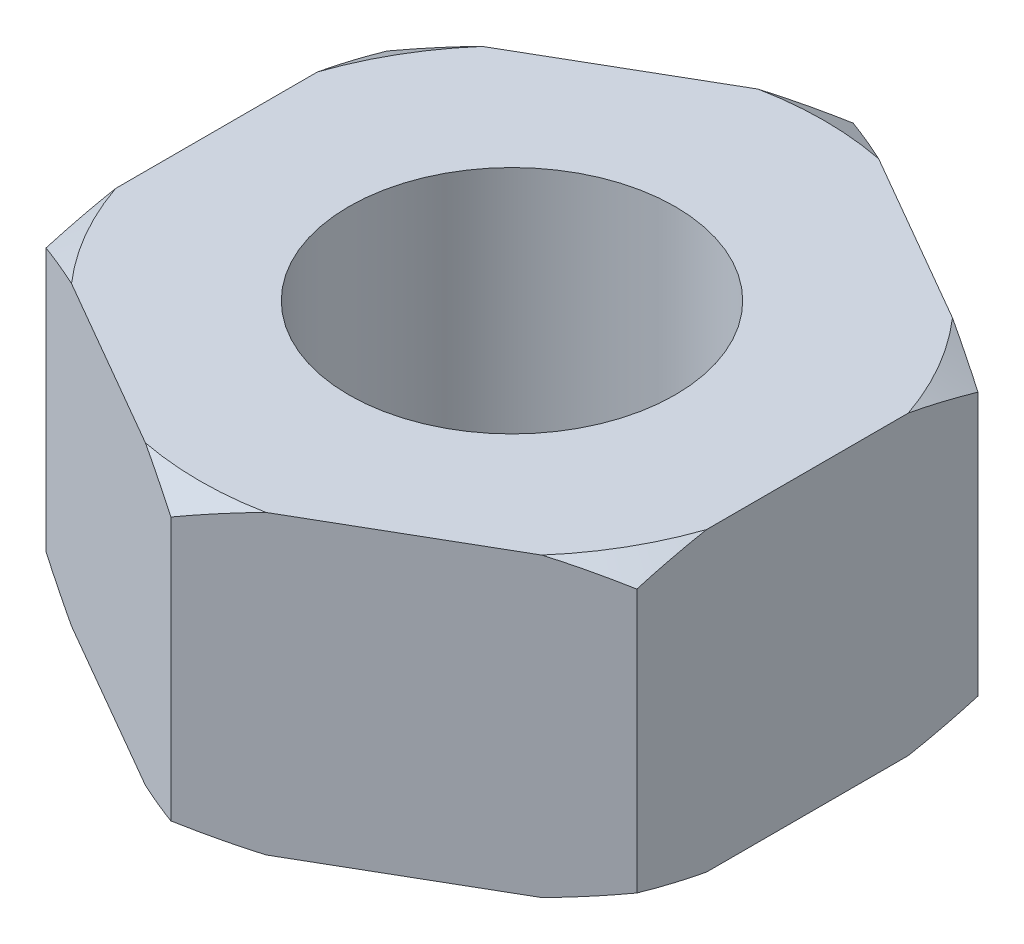
ISO-10303-21;
HEADER;
FILE_DESCRIPTION(('STEP AP214'),'2;1');
FILE_NAME('part.step','',(''),(''),'','','');
FILE_SCHEMA(('AUTOMOTIVE_DESIGN { 1 0 10303 214 1 1 1 1 }'));
ENDSEC;
DATA;
#1=APPLICATION_CONTEXT('core data for automotive mechanical design processes');
#2=APPLICATION_PROTOCOL_DEFINITION('international standard','automotive_design',2000,#1);
#3=PRODUCT_CONTEXT('',#1,'mechanical');
#4=PRODUCT('Part','Part','',(#3));
#5=PRODUCT_RELATED_PRODUCT_CATEGORY('part','',(#4));
#6=PRODUCT_DEFINITION_FORMATION('','',#4);
#7=PRODUCT_DEFINITION_CONTEXT('part definition',#1,'design');
#8=PRODUCT_DEFINITION('design','',#6,#7);
#9=PRODUCT_DEFINITION_SHAPE('','',#8);
#10=(LENGTH_UNIT() NAMED_UNIT(*) SI_UNIT(.MILLI.,.METRE.));
#11=(NAMED_UNIT(*) PLANE_ANGLE_UNIT() SI_UNIT($,.RADIAN.));
#12=(NAMED_UNIT(*) SI_UNIT($,.STERADIAN.) SOLID_ANGLE_UNIT());
#13=UNCERTAINTY_MEASURE_WITH_UNIT(LENGTH_MEASURE(1.E-05),#10,'distance_accuracy_value','');
#14=(GEOMETRIC_REPRESENTATION_CONTEXT(3) GLOBAL_UNCERTAINTY_ASSIGNED_CONTEXT((#13)) GLOBAL_UNIT_ASSIGNED_CONTEXT((#10,
#11,#12)) REPRESENTATION_CONTEXT('',''));
#15=CARTESIAN_POINT('',(0.,0.,0.));
#16=DIRECTION('',(0.,0.,1.));
#17=DIRECTION('',(1.,0.,0.));
#18=AXIS2_PLACEMENT_3D('',#15,#16,#17);
#19=CARTESIAN_POINT('',(0.,3.,0.));
#20=DIRECTION('',(0.,-1.,0.));
#21=DIRECTION('',(0.,0.,-1.));
#22=AXIS2_PLACEMENT_3D('',#19,#20,#21);
#23=CONICAL_SURFACE('',#22,3.15717967697245,1.0471975511966);
#24=CARTESIAN_POINT('',(-2.98778764305632,2.83073800433458,-1.72569999999995));
#25=CARTESIAN_POINT('',(-2.98778764305632,2.87453234537664,-1.57408157926667));
#26=CARTESIAN_POINT('',(-2.98778764305632,2.91436354131147,-1.42115441667415));
#27=CARTESIAN_POINT('',(-2.98778764305631,2.98389351559366,-1.11265129721507));
#28=CARTESIAN_POINT('',(-2.98778764305631,3.01356768949335,-0.957069853495317));
#29=CARTESIAN_POINT('',(-2.98778764305631,3.05976564084917,-0.647835363848516));
#30=CARTESIAN_POINT('',(-2.98778764305631,3.07659679214302,-0.494229932389961));
#31=CARTESIAN_POINT('',(-2.9877876430563,3.0966996775807,-0.186295293789725));
#32=CARTESIAN_POINT('',(-2.9877876430563,3.09998804807221,-0.0319672079559725));
#33=CARTESIAN_POINT('',(-2.9877876430563,3.09319336195354,0.256470525833416));
#34=CARTESIAN_POINT('',(-2.9877876430563,3.0847786451927,0.390623074181776));
#35=CARTESIAN_POINT('',(-2.98778764305629,3.05809454989863,0.658054054039131));
#36=CARTESIAN_POINT('',(-2.98778764305629,3.03981603195721,0.791331558663171));
#37=CARTESIAN_POINT('',(-2.98778764305629,2.99411549339855,1.0593151542391));
#38=CARTESIAN_POINT('',(-2.98778764305628,2.96649950437058,1.19398728015132));
#39=CARTESIAN_POINT('',(-2.98778764305628,2.90381989839535,1.46132146027543));
#40=CARTESIAN_POINT('',(-2.98778764305628,2.86877103517279,1.59398694672896));
#41=CARTESIAN_POINT('',(-2.98778764305628,2.83073800433458,1.72570000000003));
#42=B_SPLINE_CURVE_WITH_KNOTS('',3,(#24,#25,#26,#27,#28,#29,#30,#31,#32,#33,#34,#35,#36,#37,#38,
#39,#40,#41),.UNSPECIFIED.,.F.,.F.,(4,2,2,2,2,2,2,2,4),(0.,0.473636195491021,0.94841174288621,
1.41143339225394,1.87388608232874,2.27675078121051,2.67998940112553,3.09217948458054,
3.50355893241453),.UNSPECIFIED.);
#43=CARTESIAN_POINT('',(-2.98778764305629,3.,1.02024924047411));
#44=VERTEX_POINT('',#43);
#45=CARTESIAN_POINT('',(-2.98778764305628,2.83094010767586,1.72500000000003));
#46=VERTEX_POINT('',#45);
#47=EDGE_CURVE('E425',#44,#46,#42,.T.);
#48=ORIENTED_EDGE('',*,*,#47,.T.);
#49=CARTESIAN_POINT('',(-2.98848764305628,2.83070673334709,1.7245958548116));
#50=CARTESIAN_POINT('',(-2.85718065584434,2.87450364187515,1.80040597922489));
#51=CARTESIAN_POINT('',(-2.72474025480589,2.91433756491633,1.87687048041602));
#52=CARTESIAN_POINT('',(-2.45756537307024,2.98387319936846,2.03112397030679));
#53=CARTESIAN_POINT('',(-2.3228261396034,3.01355030277322,2.10891570301927));
#54=CARTESIAN_POINT('',(-2.05501778344575,3.05975404564121,2.26353492953812));
#55=CARTESIAN_POINT('',(-1.92198990306803,3.07658807660561,2.34033861208392));
#56=CARTESIAN_POINT('',(-1.6553071402995,3.09669652809824,2.49430797695656));
#57=CARTESIAN_POINT('',(-1.52165322938043,3.0999875873303,2.57147309840393));
#58=CARTESIAN_POINT('',(-1.2718429741216,3.09319715341216,2.71570111652394));
#59=CARTESIAN_POINT('',(-1.15564952564982,3.08478295899708,2.78278543527719));
#60=CARTESIAN_POINT('',(-0.924019747822204,3.05809745691394,2.91651694985829));
#61=CARTESIAN_POINT('',(-0.80858422161751,3.0398170042283,2.98316368198662));
#62=CARTESIAN_POINT('',(-0.57647558161307,2.99411042437658,3.11717166777442));
#63=CARTESIAN_POINT('',(-0.459831894697397,2.96649025096054,3.18451593181445));
#64=CARTESIAN_POINT('',(-0.228285776446345,2.90380068605167,3.3181991455165));
#65=CARTESIAN_POINT('',(-0.113380370999478,2.86874605619617,3.38453981228259));
#66=CARTESIAN_POINT('',(0.000700000000045206,2.83070673334709,3.45040414518842));
#67=B_SPLINE_CURVE_WITH_KNOTS('',3,(#49,#50,#51,#52,#53,#54,#55,#56,#57,#58,#59,#60,#61,#62,#63,
#64,#65,#66),.UNSPECIFIED.,.F.,.F.,(4,2,2,2,2,2,2,2,4),(0.,0.473643612206693,0.948426779423881,
1.41145513696918,1.87391445426214,2.27682707364599,2.6801137950185,3.09235452755995,
3.50378426473884),.UNSPECIFIED.);
#68=CARTESIAN_POINT('',(-2.37745558197045,3.,2.07737537976298));
#69=VERTEX_POINT('',#68);
#70=EDGE_CURVE('E52',#46,#69,#67,.T.);
#71=ORIENTED_EDGE('',*,*,#70,.T.);
#72=CARTESIAN_POINT('',(0.,3.,0.));
#73=DIRECTION('',(0.,1.,0.));
#74=DIRECTION('',(0.,0.,1.));
#75=AXIS2_PLACEMENT_3D('',#72,#73,#74);
#76=CIRCLE('',#75,3.15717967697245);
#77=EDGE_CURVE('E206',#44,#69,#76,.T.);
#78=ORIENTED_EDGE('',*,*,#77,.F.);
#79=EDGE_LOOP('',(#48,#71,#78));
#80=FACE_BOUND('',#79,.T.);
#81=ADVANCED_FACE('F46',(#80),#23,.T.);
#82=CARTESIAN_POINT('',(0.000699999999953867,2.83070673334709,-3.45040414518842));
#83=CARTESIAN_POINT('',(-0.130606987211985,2.87450364187515,-3.37459402077512));
#84=CARTESIAN_POINT('',(-0.263047388250431,2.91433756491633,-3.29812951958399));
#85=CARTESIAN_POINT('',(-0.530222269986073,2.98387319936846,-3.14387602969321));
#86=CARTESIAN_POINT('',(-0.664961503452909,3.01355030277322,-3.06608429698072));
#87=CARTESIAN_POINT('',(-0.932769859610556,3.05975404564121,-2.91146507046187));
#88=CARTESIAN_POINT('',(-1.06579773998828,3.07658807660561,-2.83466138791607));
#89=CARTESIAN_POINT('',(-1.3324805027568,3.09669652809824,-2.68069202304342));
#90=CARTESIAN_POINT('',(-1.46613441367587,3.0999875873303,-2.60352690159605));
#91=CARTESIAN_POINT('',(-1.7159446689347,3.09319715341216,-2.45929888347603));
#92=CARTESIAN_POINT('',(-1.83213811740647,3.08478295899708,-2.39221456472278));
#93=CARTESIAN_POINT('',(-2.06376789523409,3.05809745691394,-2.25848305014167));
#94=CARTESIAN_POINT('',(-2.17920342143878,3.0398170042283,-2.19183631801334));
#95=CARTESIAN_POINT('',(-2.41131206144322,2.99411042437658,-2.05782833222554));
#96=CARTESIAN_POINT('',(-2.52795574835889,2.96649025096054,-1.9904840681855));
#97=CARTESIAN_POINT('',(-2.75950186660994,2.90380068605167,-1.85680085448344));
#98=CARTESIAN_POINT('',(-2.8744072720568,2.86874605619617,-1.79046018771735));
#99=CARTESIAN_POINT('',(-2.98848764305632,2.83070673334709,-1.72459585481152));
#100=B_SPLINE_CURVE_WITH_KNOTS('',3,(#82,#83,#84,#85,#86,#87,#88,#89,#90,#91,#92,#93,#94,#95,
#96,#97,#98,#99),.UNSPECIFIED.,.F.,.F.,(4,2,2,2,2,2,2,2,4),(0.,0.473643612206694,
0.948426779423881,1.41145513696918,1.87391445426214,2.27682707364599,2.6801137950185,
3.09235452755995,3.50378426473884),.UNSPECIFIED.);
#101=CARTESIAN_POINT('',(-2.3774555819705,3.,-2.07737537976292));
#102=VERTEX_POINT('',#101);
#103=CARTESIAN_POINT('',(-2.98778764305632,2.83094010767586,-1.72499999999995));
#104=VERTEX_POINT('',#103);
#105=EDGE_CURVE('E280',#102,#104,#100,.T.);
#106=ORIENTED_EDGE('',*,*,#105,.T.);
#107=CARTESIAN_POINT('',(-2.98778764305631,3.,-1.02024924047403));
#108=VERTEX_POINT('',#107);
#109=EDGE_CURVE('E281',#104,#108,#42,.T.);
#110=ORIENTED_EDGE('',*,*,#109,.T.);
#111=EDGE_CURVE('E211',#102,#108,#76,.T.);
#112=ORIENTED_EDGE('',*,*,#111,.F.);
#113=EDGE_LOOP('',(#106,#110,#112));
#114=FACE_BOUND('',#113,.T.);
#115=ADVANCED_FACE('F393',(#114),#23,.T.);
#116=CARTESIAN_POINT('',(2.98848764305628,2.83070673334709,-1.7245958548116));
#117=CARTESIAN_POINT('',(2.85718065584434,2.87450364187515,-1.80040597922489));
#118=CARTESIAN_POINT('',(2.72474025480589,2.91433756491633,-1.87687048041602));
#119=CARTESIAN_POINT('',(2.45756537307024,2.98387319936846,-2.03112397030679));
#120=CARTESIAN_POINT('',(2.3228261396034,3.01355030277322,-2.10891570301927));
#121=CARTESIAN_POINT('',(2.05501778344575,3.05975404564121,-2.26353492953812));
#122=CARTESIAN_POINT('',(1.92198990306803,3.07658807660561,-2.34033861208392));
#123=CARTESIAN_POINT('',(1.6553071402995,3.09669652809824,-2.49430797695656));
#124=CARTESIAN_POINT('',(1.52165322938043,3.09998758733029,-2.57147309840393));
#125=CARTESIAN_POINT('',(1.2718429741216,3.09319715341216,-2.71570111652394));
#126=CARTESIAN_POINT('',(1.15564952564982,3.08478295899708,-2.78278543527719));
#127=CARTESIAN_POINT('',(0.924019747822203,3.05809745691394,-2.9165169498583));
#128=CARTESIAN_POINT('',(0.808584221617508,3.0398170042283,-2.98316368198662));
#129=CARTESIAN_POINT('',(0.576475581613069,2.99411042437658,-3.11717166777442));
#130=CARTESIAN_POINT('',(0.459831894697396,2.96649025096054,-3.18451593181445));
#131=CARTESIAN_POINT('',(0.228285776446344,2.90380068605167,-3.3181991455165));
#132=CARTESIAN_POINT('',(0.113380370999477,2.86874605619617,-3.38453981228259));
#133=CARTESIAN_POINT('',(-0.000700000000046562,2.83070673334709,-3.45040414518842));
#134=B_SPLINE_CURVE_WITH_KNOTS('',3,(#116,#117,#118,#119,#120,#121,#122,#123,#124,#125,#126,
#127,#128,#129,#130,#131,#132,#133),.UNSPECIFIED.,.F.,.F.,(4,2,2,2,2,2,2,2,4),(0.,
0.473643612206694,0.948426779423881,1.41145513696918,1.87391445426214,2.27682707364599,
2.6801137950185,3.09235452755995,3.50378426473884),.UNSPECIFIED.);
#135=CARTESIAN_POINT('',(0.610332061085784,3.,-3.09762462023703));
#136=VERTEX_POINT('',#135);
#137=CARTESIAN_POINT('',(0.,2.83094010767586,-3.44999999999998));
#138=VERTEX_POINT('',#137);
#139=EDGE_CURVE('E268',#136,#138,#134,.T.);
#140=ORIENTED_EDGE('',*,*,#139,.T.);
#141=CARTESIAN_POINT('',(-0.610332061085866,3.,-3.09762462023702));
#142=VERTEX_POINT('',#141);
#143=EDGE_CURVE('E273',#138,#142,#100,.T.);
#144=ORIENTED_EDGE('',*,*,#143,.T.);
#145=EDGE_CURVE('E204',#136,#142,#76,.T.);
#146=ORIENTED_EDGE('',*,*,#145,.F.);
#147=EDGE_LOOP('',(#140,#144,#146));
#148=FACE_BOUND('',#147,.T.);
#149=ADVANCED_FACE('F398',(#148),#23,.T.);
#150=CARTESIAN_POINT('',(2.98778764305632,2.83073800433458,1.72569999999995));
#151=CARTESIAN_POINT('',(2.98778764305632,2.87453234537664,1.57408157926667));
#152=CARTESIAN_POINT('',(2.98778764305632,2.91436354131147,1.42115441667415));
#153=CARTESIAN_POINT('',(2.98778764305631,2.98389351559366,1.11265129721507));
#154=CARTESIAN_POINT('',(2.98778764305631,3.01356768949335,0.957069853495318));
#155=CARTESIAN_POINT('',(2.98778764305631,3.05976564084917,0.647835363848517));
#156=CARTESIAN_POINT('',(2.98778764305631,3.07659679214302,0.494229932389961));
#157=CARTESIAN_POINT('',(2.9877876430563,3.0966996775807,0.186295293789725));
#158=CARTESIAN_POINT('',(2.9877876430563,3.09998804807221,0.0319672079559729));
#159=CARTESIAN_POINT('',(2.9877876430563,3.09319336195354,-0.256470525833416));
#160=CARTESIAN_POINT('',(2.98778764305629,3.0847786451927,-0.390623074181777));
#161=CARTESIAN_POINT('',(2.98778764305629,3.05809454989863,-0.658054054039132));
#162=CARTESIAN_POINT('',(2.98778764305629,3.03981603195721,-0.791331558663172));
#163=CARTESIAN_POINT('',(2.98778764305629,2.99411549339855,-1.0593151542391));
#164=CARTESIAN_POINT('',(2.98778764305628,2.96649950437058,-1.19398728015132));
#165=CARTESIAN_POINT('',(2.98778764305628,2.90381989839535,-1.46132146027543));
#166=CARTESIAN_POINT('',(2.98778764305628,2.86877103517279,-1.59398694672896));
#167=CARTESIAN_POINT('',(2.98778764305628,2.83073800433458,-1.72570000000003));
#168=B_SPLINE_CURVE_WITH_KNOTS('',3,(#150,#151,#152,#153,#154,#155,#156,#157,#158,#159,#160,
#161,#162,#163,#164,#165,#166,#167),.UNSPECIFIED.,.F.,.F.,(4,2,2,2,2,2,2,2,4),(0.,
0.473636195491021,0.94841174288621,1.41143339225394,1.87388608232874,2.27675078121051,
2.67998940112553,3.09217948458054,3.50355893241453),.UNSPECIFIED.);
#169=CARTESIAN_POINT('',(2.98778764305629,3.,-1.02024924047412));
#170=VERTEX_POINT('',#169);
#171=CARTESIAN_POINT('',(2.98778764305628,2.83094010767586,-1.72500000000003));
#172=VERTEX_POINT('',#171);
#173=EDGE_CURVE('E183',#170,#172,#168,.T.);
#174=ORIENTED_EDGE('',*,*,#173,.T.);
#175=CARTESIAN_POINT('',(2.37745558197045,3.,-2.07737537976298));
#176=VERTEX_POINT('',#175);
#177=EDGE_CURVE('E196',#172,#176,#134,.T.);
#178=ORIENTED_EDGE('',*,*,#177,.T.);
#179=EDGE_CURVE('E201',#170,#176,#76,.T.);
#180=ORIENTED_EDGE('',*,*,#179,.F.);
#181=EDGE_LOOP('',(#174,#178,#180));
#182=FACE_BOUND('',#181,.T.);
#183=ADVANCED_FACE('F403',(#182),#23,.T.);
#184=CARTESIAN_POINT('',(2.3774555819705,3.,2.07737537976292));
#185=VERTEX_POINT('',#184);
#186=CARTESIAN_POINT('',(2.98778764305631,3.,1.02024924047404));
#187=VERTEX_POINT('',#186);
#188=EDGE_CURVE('E195',#185,#187,#76,.T.);
#189=ORIENTED_EDGE('',*,*,#188,.F.);
#190=CARTESIAN_POINT('',(-0.000699999999955139,2.83070673334709,3.45040414518842));
#191=CARTESIAN_POINT('',(0.130606987211983,2.87450364187515,3.37459402077512));
#192=CARTESIAN_POINT('',(0.26304738825043,2.91433756491634,3.29812951958399));
#193=CARTESIAN_POINT('',(0.530222269986072,2.98387319936846,3.14387602969321));
#194=CARTESIAN_POINT('',(0.664961503452908,3.01355030277322,3.06608429698072));
#195=CARTESIAN_POINT('',(0.932769859610555,3.05975404564121,2.91146507046187));
#196=CARTESIAN_POINT('',(1.06579773998827,3.07658807660561,2.83466138791607));
#197=CARTESIAN_POINT('',(1.3324805027568,3.09669652809824,2.68069202304342));
#198=CARTESIAN_POINT('',(1.46613441367587,3.0999875873303,2.60352690159605));
#199=CARTESIAN_POINT('',(1.7159446689347,3.09319715341216,2.45929888347603));
#200=CARTESIAN_POINT('',(1.83213811740647,3.08478295899708,2.39221456472278));
#201=CARTESIAN_POINT('',(2.06376789523409,3.05809745691394,2.25848305014167));
#202=CARTESIAN_POINT('',(2.17920342143878,3.0398170042283,2.19183631801334));
#203=CARTESIAN_POINT('',(2.41131206144322,2.99411042437658,2.05782833222554));
#204=CARTESIAN_POINT('',(2.52795574835889,2.96649025096054,1.9904840681855));
#205=CARTESIAN_POINT('',(2.75950186660994,2.90380068605167,1.85680085448344));
#206=CARTESIAN_POINT('',(2.8744072720568,2.86874605619617,1.79046018771735));
#207=CARTESIAN_POINT('',(2.98848764305632,2.83070673334709,1.72459585481152));
#208=B_SPLINE_CURVE_WITH_KNOTS('',3,(#190,#191,#192,#193,#194,#195,#196,#197,#198,#199,#200,
#201,#202,#203,#204,#205,#206,#207),.UNSPECIFIED.,.F.,.F.,(4,2,2,2,2,2,2,2,4),(0.,
0.473643612206694,0.94842677942388,1.41145513696918,1.87391445426214,2.27682707364599,
2.6801137950185,3.09235452755995,3.50378426473884),.UNSPECIFIED.);
#209=CARTESIAN_POINT('',(2.98778764305632,2.83094010767586,1.72499999999995));
#210=VERTEX_POINT('',#209);
#211=EDGE_CURVE('E64',#185,#210,#208,.T.);
#212=ORIENTED_EDGE('',*,*,#211,.T.);
#213=EDGE_CURVE('E181',#210,#187,#168,.T.);
#214=ORIENTED_EDGE('',*,*,#213,.T.);
#215=EDGE_LOOP('',(#189,#212,#214));
#216=FACE_BOUND('',#215,.T.);
#217=ADVANCED_FACE('F194',(#216),#23,.T.);
#218=CARTESIAN_POINT('',(-0.610332061085783,3.,3.09762462023703));
#219=VERTEX_POINT('',#218);
#220=CARTESIAN_POINT('',(0.,2.83094010767586,3.44999999999998));
#221=VERTEX_POINT('',#220);
#222=EDGE_CURVE('E62',#219,#221,#67,.T.);
#223=ORIENTED_EDGE('',*,*,#222,.T.);
#224=CARTESIAN_POINT('',(0.610332061085864,3.,3.09762462023702));
#225=VERTEX_POINT('',#224);
#226=EDGE_CURVE('E12',#221,#225,#208,.T.);
#227=ORIENTED_EDGE('',*,*,#226,.T.);
#228=EDGE_CURVE('E203',#219,#225,#76,.T.);
#229=ORIENTED_EDGE('',*,*,#228,.F.);
#230=EDGE_LOOP('',(#223,#227,#229));
#231=FACE_BOUND('',#230,.T.);
#232=ADVANCED_FACE('F49',(#231),#23,.T.);
#233=CARTESIAN_POINT('',(0.,3.,0.));
#234=DIRECTION('',(0.,1.,0.));
#235=DIRECTION('',(0.,0.,1.));
#236=AXIS2_PLACEMENT_3D('',#233,#234,#235);
#237=PLANE('',#236);
#238=CARTESIAN_POINT('',(0.,3.,0.));
#239=DIRECTION('',(0.,-1.,0.));
#240=DIRECTION('',(0.,0.,-1.));
#241=AXIS2_PLACEMENT_3D('',#238,#239,#240);
#242=CIRCLE('',#241,1.65);
#243=CARTESIAN_POINT('',(0.,3.,-1.65));
#244=VERTEX_POINT('',#243);
#245=EDGE_CURVE('E340',#244,#244,#242,.T.);
#246=ORIENTED_EDGE('',*,*,#245,.T.);
#247=EDGE_LOOP('',(#246));
#248=FACE_BOUND('',#247,.T.);
#249=ORIENTED_EDGE('',*,*,#228,.T.);
#250=DIRECTION('',(0.866025403784432,0.,-0.500000000000011));
#251=VECTOR('',#250,1.);
#252=CARTESIAN_POINT('',(0.,3.,3.44999999999998));
#253=LINE('',#252,#251);
#254=EDGE_CURVE('E189',#225,#185,#253,.T.);
#255=ORIENTED_EDGE('',*,*,#254,.T.);
#256=ORIENTED_EDGE('',*,*,#188,.T.);
#257=DIRECTION('',(0.,0.,-1.));
#258=VECTOR('',#257,1.);
#259=CARTESIAN_POINT('',(2.98778764305632,3.,1.72499999999995));
#260=LINE('',#259,#258);
#261=EDGE_CURVE('E178',#187,#170,#260,.T.);
#262=ORIENTED_EDGE('',*,*,#261,.T.);
#263=ORIENTED_EDGE('',*,*,#179,.T.);
#264=DIRECTION('',(-0.866025403784445,0.,-0.499999999999989));
#265=VECTOR('',#264,1.);
#266=CARTESIAN_POINT('',(2.98778764305628,3.,-1.72500000000003));
#267=LINE('',#266,#265);
#268=EDGE_CURVE('E188',#176,#136,#267,.T.);
#269=ORIENTED_EDGE('',*,*,#268,.T.);
#270=ORIENTED_EDGE('',*,*,#145,.T.);
#271=DIRECTION('',(-0.866025403784432,0.,0.500000000000011));
#272=VECTOR('',#271,1.);
#273=CARTESIAN_POINT('',(0.,3.,-3.44999999999998));
#274=LINE('',#273,#272);
#275=EDGE_CURVE('E344',#142,#102,#274,.T.);
#276=ORIENTED_EDGE('',*,*,#275,.T.);
#277=ORIENTED_EDGE('',*,*,#111,.T.);
#278=DIRECTION('',(0.,0.,1.));
#279=VECTOR('',#278,1.);
#280=CARTESIAN_POINT('',(-2.98778764305632,3.,-1.72499999999995));
#281=LINE('',#280,#279);
#282=EDGE_CURVE('E347',#108,#44,#281,.T.);
#283=ORIENTED_EDGE('',*,*,#282,.T.);
#284=ORIENTED_EDGE('',*,*,#77,.T.);
#285=DIRECTION('',(0.866025403784445,0.,0.499999999999989));
#286=VECTOR('',#285,1.);
#287=CARTESIAN_POINT('',(-2.98778764305628,3.,1.72500000000003));
#288=LINE('',#287,#286);
#289=EDGE_CURVE('E350',#69,#219,#288,.T.);
#290=ORIENTED_EDGE('',*,*,#289,.T.);
#291=EDGE_LOOP('',(#249,#255,#256,#262,#263,#269,#270,#276,#277,#283,#284,#290));
#292=FACE_BOUND('',#291,.T.);
#293=ADVANCED_FACE('F200',(#248,#292),#237,.T.);
#294=CARTESIAN_POINT('',(0.,0.,3.44999999999998));
#295=DIRECTION('',(0.500000000000011,0.,0.866025403784432));
#296=DIRECTION('',(0.866025403784432,0.,-0.500000000000011));
#297=AXIS2_PLACEMENT_3D('',#294,#295,#296);
#298=PLANE('',#297);
#299=DIRECTION('',(0.,1.,0.));
#300=VECTOR('',#299,1.);
#301=CARTESIAN_POINT('',(2.98778764305632,0.,1.72499999999995));
#302=LINE('',#301,#300);
#303=CARTESIAN_POINT('',(2.98778764305632,0.169059892324141,1.72499999999995));
#304=VERTEX_POINT('',#303);
#305=EDGE_CURVE('E71',#304,#210,#302,.T.);
#306=ORIENTED_EDGE('',*,*,#305,.T.);
#307=ORIENTED_EDGE('',*,*,#211,.F.);
#308=ORIENTED_EDGE('',*,*,#254,.F.);
#309=ORIENTED_EDGE('',*,*,#226,.F.);
#310=DIRECTION('',(0.,1.,0.));
#311=VECTOR('',#310,1.);
#312=CARTESIAN_POINT('',(0.,0.,3.44999999999998));
#313=LINE('',#312,#311);
#314=CARTESIAN_POINT('',(0.,0.169059892324141,3.44999999999998));
#315=VERTEX_POINT('',#314);
#316=EDGE_CURVE('E353',#315,#221,#313,.T.);
#317=ORIENTED_EDGE('',*,*,#316,.F.);
#318=CARTESIAN_POINT('',(2.98848764305632,0.169293266652908,1.72459585481152));
#319=CARTESIAN_POINT('',(2.85718065584438,0.125496358124845,1.80040597922481));
#320=CARTESIAN_POINT('',(2.72474025480594,0.0856624350836629,1.87687048041595));
#321=CARTESIAN_POINT('',(2.4575653730703,0.0161268006315367,2.03112397030673));
#322=CARTESIAN_POINT('',(2.32282613960346,-0.013550302773221,2.10891570301921));
#323=CARTESIAN_POINT('',(2.05501778344581,-0.0597540456412099,2.26353492953807));
#324=CARTESIAN_POINT('',(1.92198990306809,-0.0765880766056098,2.34033861208387));
#325=CARTESIAN_POINT('',(1.65530714029957,-0.096696528098241,2.49430797695652));
#326=CARTESIAN_POINT('',(1.5216532293805,-0.0999875873302971,2.57147309840389));
#327=CARTESIAN_POINT('',(1.27184297412167,-0.0931971534121613,2.71570111652391));
#328=CARTESIAN_POINT('',(1.1556495256499,-0.0847829589970818,2.78278543527716));
#329=CARTESIAN_POINT('',(0.92401974782228,-0.0580974569139427,2.91651694985827));
#330=CARTESIAN_POINT('',(0.808584221617588,-0.0398170042283034,2.9831636819866));
#331=CARTESIAN_POINT('',(0.576475581613151,0.00588957562342028,3.1171716677744));
#332=CARTESIAN_POINT('',(0.459831894697481,0.0335097490394607,3.18451593181444));
#333=CARTESIAN_POINT('',(0.228285776446432,0.0961993139483314,3.3181991455165));
#334=CARTESIAN_POINT('',(0.113380370999567,0.131253943803826,3.38453981228259));
#335=CARTESIAN_POINT('',(-0.000699999999955318,0.169293266652908,3.45040414518842));
#336=B_SPLINE_CURVE_WITH_KNOTS('',3,(#318,#319,#320,#321,#322,#323,#324,#325,#326,#327,#328,
#329,#330,#331,#332,#333,#334,#335),.UNSPECIFIED.,.F.,.F.,(4,2,2,2,2,2,2,2,4),(0.,
0.473643612206693,0.94842677942388,1.41145513696918,1.87391445426214,2.27682707364599,
2.6801137950185,3.09235452755995,3.50378426473884),.UNSPECIFIED.);
#337=CARTESIAN_POINT('',(0.610332061085854,0.,3.09762462023702));
#338=VERTEX_POINT('',#337);
#339=EDGE_CURVE('E230',#338,#315,#336,.T.);
#340=ORIENTED_EDGE('',*,*,#339,.F.);
#341=DIRECTION('',(0.866025403784432,0.,-0.500000000000011));
#342=VECTOR('',#341,1.);
#343=CARTESIAN_POINT('',(0.,0.,3.44999999999998));
#344=LINE('',#343,#342);
#345=CARTESIAN_POINT('',(2.37745558197051,0.,2.07737537976292));
#346=VERTEX_POINT('',#345);
#347=EDGE_CURVE('E352',#338,#346,#344,.T.);
#348=ORIENTED_EDGE('',*,*,#347,.T.);
#349=EDGE_CURVE('E224',#304,#346,#336,.T.);
#350=ORIENTED_EDGE('',*,*,#349,.F.);
#351=EDGE_LOOP('',(#306,#307,#308,#309,#317,#340,#348,#350));
#352=FACE_BOUND('',#351,.T.);
#353=ADVANCED_FACE('F252',(#352),#298,.T.);
#354=CARTESIAN_POINT('',(-2.98778764305628,0.,1.72500000000003));
#355=DIRECTION('',(-0.499999999999989,0.,0.866025403784445));
#356=DIRECTION('',(0.866025403784445,0.,0.499999999999989));
#357=AXIS2_PLACEMENT_3D('',#354,#355,#356);
#358=PLANE('',#357);
#359=ORIENTED_EDGE('',*,*,#316,.T.);
#360=ORIENTED_EDGE('',*,*,#222,.F.);
#361=ORIENTED_EDGE('',*,*,#289,.F.);
#362=ORIENTED_EDGE('',*,*,#70,.F.);
#363=DIRECTION('',(0.,1.,0.));
#364=VECTOR('',#363,1.);
#365=CARTESIAN_POINT('',(-2.98778764305628,0.,1.72500000000003));
#366=LINE('',#365,#364);
#367=CARTESIAN_POINT('',(-2.98778764305628,0.169059892324141,1.72500000000003));
#368=VERTEX_POINT('',#367);
#369=EDGE_CURVE('E357',#368,#46,#366,.T.);
#370=ORIENTED_EDGE('',*,*,#369,.F.);
#371=CARTESIAN_POINT('',(0.000700000000044852,0.169293266652908,3.45040414518842));
#372=CARTESIAN_POINT('',(-0.130606987211896,0.125496358124845,3.37459402077513));
#373=CARTESIAN_POINT('',(-0.263047388250343,0.0856624350836628,3.298129519584));
#374=CARTESIAN_POINT('',(-0.53022226998599,0.0161268006315365,3.14387602969322));
#375=CARTESIAN_POINT('',(-0.664961503452828,-0.0135503027732213,3.06608429698074));
#376=CARTESIAN_POINT('',(-0.932769859610479,-0.0597540456412101,2.91146507046189));
#377=CARTESIAN_POINT('',(-1.0657977399882,-0.0765880766056098,2.83466138791609));
#378=CARTESIAN_POINT('',(-1.33248050275673,-0.0966965280982409,2.68069202304345));
#379=CARTESIAN_POINT('',(-1.4661344136758,-0.0999875873302971,2.60352690159609));
#380=CARTESIAN_POINT('',(-1.71594466893463,-0.0931971534121613,2.45929888347607));
#381=CARTESIAN_POINT('',(-1.83213811740641,-0.0847829589970816,2.39221456472283));
#382=CARTESIAN_POINT('',(-2.06376789523403,-0.0580974569139424,2.25848305014172));
#383=CARTESIAN_POINT('',(-2.17920342143872,-0.0398170042283031,2.1918363180134));
#384=CARTESIAN_POINT('',(-2.41131206144316,0.00588957562342046,2.0578283322256));
#385=CARTESIAN_POINT('',(-2.52795574835884,0.0335097490394607,1.99048406818557));
#386=CARTESIAN_POINT('',(-2.75950186660989,0.0961993139483314,1.85680085448351));
#387=CARTESIAN_POINT('',(-2.87440727205675,0.131253943803826,1.79046018771742));
#388=CARTESIAN_POINT('',(-2.98848764305628,0.169293266652908,1.7245958548116));
#389=B_SPLINE_CURVE_WITH_KNOTS('',3,(#371,#372,#373,#374,#375,#376,#377,#378,#379,#380,#381,
#382,#383,#384,#385,#386,#387,#388),.UNSPECIFIED.,.F.,.F.,(4,2,2,2,2,2,2,2,4),(0.,
0.473643612206694,0.948426779423881,1.41145513696918,1.87391445426214,2.27682707364599,
2.6801137950185,3.09235452755995,3.50378426473884),.UNSPECIFIED.);
#390=CARTESIAN_POINT('',(-2.37745558197046,0.,2.07737537976298));
#391=VERTEX_POINT('',#390);
#392=EDGE_CURVE('E242',#391,#368,#389,.T.);
#393=ORIENTED_EDGE('',*,*,#392,.F.);
#394=DIRECTION('',(0.866025403784445,0.,0.499999999999989));
#395=VECTOR('',#394,1.);
#396=CARTESIAN_POINT('',(-2.98778764305628,0.,1.72500000000003));
#397=LINE('',#396,#395);
#398=CARTESIAN_POINT('',(-0.610332061085774,0.,3.09762462023704));
#399=VERTEX_POINT('',#398);
#400=EDGE_CURVE('E333',#391,#399,#397,.T.);
#401=ORIENTED_EDGE('',*,*,#400,.T.);
#402=EDGE_CURVE('E235',#315,#399,#389,.T.);
#403=ORIENTED_EDGE('',*,*,#402,.F.);
#404=EDGE_LOOP('',(#359,#360,#361,#362,#370,#393,#401,#403));
#405=FACE_BOUND('',#404,.T.);
#406=ADVANCED_FACE('F257',(#405),#358,.T.);
#407=CARTESIAN_POINT('',(-2.98778764305632,0.,-1.72499999999995));
#408=DIRECTION('',(-1.,0.,0.));
#409=DIRECTION('',(0.,0.,1.));
#410=AXIS2_PLACEMENT_3D('',#407,#408,#409);
#411=PLANE('',#410);
#412=ORIENTED_EDGE('',*,*,#369,.T.);
#413=ORIENTED_EDGE('',*,*,#47,.F.);
#414=ORIENTED_EDGE('',*,*,#282,.F.);
#415=ORIENTED_EDGE('',*,*,#109,.F.);
#416=DIRECTION('',(0.,1.,0.));
#417=VECTOR('',#416,1.);
#418=CARTESIAN_POINT('',(-2.98778764305632,0.,-1.72499999999995));
#419=LINE('',#418,#417);
#420=CARTESIAN_POINT('',(-2.98778764305632,0.169059892324141,-1.72499999999995));
#421=VERTEX_POINT('',#420);
#422=EDGE_CURVE('E360',#421,#104,#419,.T.);
#423=ORIENTED_EDGE('',*,*,#422,.F.);
#424=CARTESIAN_POINT('',(-2.98778764305628,0.169261995665415,1.72570000000003));
#425=CARTESIAN_POINT('',(-2.98778764305628,0.125467654623359,1.57408157926675));
#426=CARTESIAN_POINT('',(-2.98778764305628,0.0856364586885326,1.42115441667423));
#427=CARTESIAN_POINT('',(-2.98778764305629,0.0161064844063391,1.11265129721515));
#428=CARTESIAN_POINT('',(-2.98778764305629,-0.0135676894933535,0.957069853495395));
#429=CARTESIAN_POINT('',(-2.98778764305629,-0.0597656408491712,0.647835363848594));
#430=CARTESIAN_POINT('',(-2.98778764305629,-0.0765967921430249,0.494229932390039));
#431=CARTESIAN_POINT('',(-2.9877876430563,-0.0966996775807003,0.186295293789803));
#432=CARTESIAN_POINT('',(-2.9877876430563,-0.0999880480722097,0.0319672079560505));
#433=CARTESIAN_POINT('',(-2.9877876430563,-0.0931933619535433,-0.256470525833338));
#434=CARTESIAN_POINT('',(-2.98778764305631,-0.0847786451927023,-0.390623074181699));
#435=CARTESIAN_POINT('',(-2.98778764305631,-0.0580945498986308,-0.658054054039053));
#436=CARTESIAN_POINT('',(-2.98778764305631,-0.0398160319572125,-0.791331558663093));
#437=CARTESIAN_POINT('',(-2.98778764305631,0.00588450660144837,-1.05931515423902));
#438=CARTESIAN_POINT('',(-2.98778764305632,0.0335004956294212,-1.19398728015125));
#439=CARTESIAN_POINT('',(-2.98778764305632,0.0961801016046479,-1.46132146027535));
#440=CARTESIAN_POINT('',(-2.98778764305632,0.131228964827213,-1.59398694672888));
#441=CARTESIAN_POINT('',(-2.98778764305632,0.169261995665415,-1.72569999999995));
#442=B_SPLINE_CURVE_WITH_KNOTS('',3,(#424,#425,#426,#427,#428,#429,#430,#431,#432,#433,#434,
#435,#436,#437,#438,#439,#440,#441),.UNSPECIFIED.,.F.,.F.,(4,2,2,2,2,2,2,2,4),(0.,
0.473636195491021,0.94841174288621,1.41143339225394,1.87388608232874,2.27675078121051,
2.67998940112553,3.09217948458054,3.50355893241453),.UNSPECIFIED.);
#443=CARTESIAN_POINT('',(-2.98778764305631,0.,-1.02024924047404));
#444=VERTEX_POINT('',#443);
#445=EDGE_CURVE('E312',#444,#421,#442,.T.);
#446=ORIENTED_EDGE('',*,*,#445,.F.);
#447=DIRECTION('',(0.,0.,1.));
#448=VECTOR('',#447,1.);
#449=CARTESIAN_POINT('',(-2.98778764305632,0.,-1.72499999999995));
#450=LINE('',#449,#448);
#451=CARTESIAN_POINT('',(-2.98778764305629,0.,1.02024924047412));
#452=VERTEX_POINT('',#451);
#453=EDGE_CURVE('E331',#444,#452,#450,.T.);
#454=ORIENTED_EDGE('',*,*,#453,.T.);
#455=EDGE_CURVE('E318',#368,#452,#442,.T.);
#456=ORIENTED_EDGE('',*,*,#455,.F.);
#457=EDGE_LOOP('',(#412,#413,#414,#415,#423,#446,#454,#456));
#458=FACE_BOUND('',#457,.T.);
#459=ADVANCED_FACE('F291',(#458),#411,.T.);
#460=CARTESIAN_POINT('',(0.,0.,-3.44999999999998));
#461=DIRECTION('',(-0.500000000000011,0.,-0.866025403784432));
#462=DIRECTION('',(-0.866025403784432,0.,0.500000000000011));
#463=AXIS2_PLACEMENT_3D('',#460,#461,#462);
#464=PLANE('',#463);
#465=ORIENTED_EDGE('',*,*,#422,.T.);
#466=ORIENTED_EDGE('',*,*,#105,.F.);
#467=ORIENTED_EDGE('',*,*,#275,.F.);
#468=ORIENTED_EDGE('',*,*,#143,.F.);
#469=DIRECTION('',(0.,1.,0.));
#470=VECTOR('',#469,1.);
#471=CARTESIAN_POINT('',(0.,0.,-3.44999999999998));
#472=LINE('',#471,#470);
#473=CARTESIAN_POINT('',(0.,0.169059892324141,-3.44999999999998));
#474=VERTEX_POINT('',#473);
#475=EDGE_CURVE('E362',#474,#138,#472,.T.);
#476=ORIENTED_EDGE('',*,*,#475,.F.);
#477=CARTESIAN_POINT('',(-2.98848764305632,0.169293266652908,-1.72459585481152));
#478=CARTESIAN_POINT('',(-2.85718065584438,0.125496358124846,-1.80040597922481));
#479=CARTESIAN_POINT('',(-2.72474025480594,0.0856624350836633,-1.87687048041595));
#480=CARTESIAN_POINT('',(-2.4575653730703,0.0161268006315371,-2.03112397030673));
#481=CARTESIAN_POINT('',(-2.32282613960346,-0.0135503027732205,-2.10891570301921));
#482=CARTESIAN_POINT('',(-2.05501778344581,-0.0597540456412096,-2.26353492953807));
#483=CARTESIAN_POINT('',(-1.92198990306809,-0.0765880766056096,-2.34033861208387));
#484=CARTESIAN_POINT('',(-1.65530714029957,-0.0966965280982407,-2.49430797695652));
#485=CARTESIAN_POINT('',(-1.5216532293805,-0.0999875873302966,-2.57147309840389));
#486=CARTESIAN_POINT('',(-1.27184297412167,-0.0931971534121608,-2.71570111652391));
#487=CARTESIAN_POINT('',(-1.1556495256499,-0.0847829589970813,-2.78278543527716));
#488=CARTESIAN_POINT('',(-0.924019747822281,-0.0580974569139422,-2.91651694985827));
#489=CARTESIAN_POINT('',(-0.808584221617588,-0.0398170042283029,-2.9831636819866));
#490=CARTESIAN_POINT('',(-0.576475581613152,0.00588957562342078,-3.1171716677744));
#491=CARTESIAN_POINT('',(-0.459831894697481,0.0335097490394611,-3.18451593181444));
#492=CARTESIAN_POINT('',(-0.228285776446433,0.0961993139483318,-3.3181991455165));
#493=CARTESIAN_POINT('',(-0.113380370999568,0.131253943803826,-3.38453981228259));
#494=CARTESIAN_POINT('',(0.0006999999999539,0.169293266652908,-3.45040414518842));
#495=B_SPLINE_CURVE_WITH_KNOTS('',3,(#477,#478,#479,#480,#481,#482,#483,#484,#485,#486,#487,
#488,#489,#490,#491,#492,#493,#494),.UNSPECIFIED.,.F.,.F.,(4,2,2,2,2,2,2,2,4),(0.,
0.473643612206694,0.948426779423881,1.41145513696918,1.87391445426214,2.27682707364599,
2.6801137950185,3.09235452755995,3.50378426473884),.UNSPECIFIED.);
#496=CARTESIAN_POINT('',(-0.610332061085857,0.,-3.09762462023702));
#497=VERTEX_POINT('',#496);
#498=EDGE_CURVE('E297',#497,#474,#495,.T.);
#499=ORIENTED_EDGE('',*,*,#498,.F.);
#500=DIRECTION('',(-0.866025403784432,0.,0.500000000000011));
#501=VECTOR('',#500,1.);
#502=CARTESIAN_POINT('',(0.,0.,-3.44999999999998));
#503=LINE('',#502,#501);
#504=CARTESIAN_POINT('',(-2.37745558197051,0.,-2.07737537976292));
#505=VERTEX_POINT('',#504);
#506=EDGE_CURVE('E329',#497,#505,#503,.T.);
#507=ORIENTED_EDGE('',*,*,#506,.T.);
#508=EDGE_CURVE('E304',#421,#505,#495,.T.);
#509=ORIENTED_EDGE('',*,*,#508,.F.);
#510=EDGE_LOOP('',(#465,#466,#467,#468,#476,#499,#507,#509));
#511=FACE_BOUND('',#510,.T.);
#512=ADVANCED_FACE('F287',(#511),#464,.T.);
#513=CARTESIAN_POINT('',(2.98778764305628,0.,-1.72500000000003));
#514=DIRECTION('',(0.499999999999989,0.,-0.866025403784445));
#515=DIRECTION('',(-0.866025403784445,0.,-0.499999999999989));
#516=AXIS2_PLACEMENT_3D('',#513,#514,#515);
#517=PLANE('',#516);
#518=ORIENTED_EDGE('',*,*,#475,.T.);
#519=ORIENTED_EDGE('',*,*,#139,.F.);
#520=ORIENTED_EDGE('',*,*,#268,.F.);
#521=ORIENTED_EDGE('',*,*,#177,.F.);
#522=DIRECTION('',(0.,1.,0.));
#523=VECTOR('',#522,1.);
#524=CARTESIAN_POINT('',(2.98778764305628,0.,-1.72500000000003));
#525=LINE('',#524,#523);
#526=CARTESIAN_POINT('',(2.98778764305628,0.16905989232414,-1.72500000000003));
#527=VERTEX_POINT('',#526);
#528=EDGE_CURVE('E78',#527,#172,#525,.T.);
#529=ORIENTED_EDGE('',*,*,#528,.F.);
#530=CARTESIAN_POINT('',(-0.000700000000046133,0.169293266652908,-3.45040414518842));
#531=CARTESIAN_POINT('',(0.130606987211894,0.125496358124846,-3.37459402077513));
#532=CARTESIAN_POINT('',(0.263047388250342,0.0856624350836635,-3.298129519584));
#533=CARTESIAN_POINT('',(0.530222269985989,0.0161268006315371,-3.14387602969322));
#534=CARTESIAN_POINT('',(0.664961503452827,-0.0135503027732207,-3.06608429698074));
#535=CARTESIAN_POINT('',(0.932769859610478,-0.0597540456412097,-2.9114650704619));
#536=CARTESIAN_POINT('',(1.0657977399882,-0.0765880766056095,-2.83466138791609));
#537=CARTESIAN_POINT('',(1.33248050275673,-0.0966965280982408,-2.68069202304346));
#538=CARTESIAN_POINT('',(1.4661344136758,-0.0999875873302971,-2.60352690159609));
#539=CARTESIAN_POINT('',(1.71594466893463,-0.0931971534121614,-2.45929888347608));
#540=CARTESIAN_POINT('',(1.83213811740641,-0.0847829589970818,-2.39221456472283));
#541=CARTESIAN_POINT('',(2.06376789523403,-0.0580974569139425,-2.25848305014172));
#542=CARTESIAN_POINT('',(2.17920342143872,-0.0398170042283032,-2.1918363180134));
#543=CARTESIAN_POINT('',(2.41131206144316,0.00588957562342045,-2.0578283322256));
#544=CARTESIAN_POINT('',(2.52795574835883,0.0335097490394607,-1.99048406818557));
#545=CARTESIAN_POINT('',(2.75950186660989,0.0961993139483311,-1.85680085448351));
#546=CARTESIAN_POINT('',(2.87440727205675,0.131253943803826,-1.79046018771742));
#547=CARTESIAN_POINT('',(2.98848764305628,0.169293266652907,-1.7245958548116));
#548=B_SPLINE_CURVE_WITH_KNOTS('',3,(#530,#531,#532,#533,#534,#535,#536,#537,#538,#539,#540,
#541,#542,#543,#544,#545,#546,#547),.UNSPECIFIED.,.F.,.F.,(4,2,2,2,2,2,2,2,4),(0.,
0.473643612206694,0.94842677942388,1.41145513696918,1.87391445426214,2.27682707364599,
2.6801137950185,3.09235452755995,3.50378426473884),.UNSPECIFIED.);
#549=CARTESIAN_POINT('',(2.37745558197046,0.,-2.07737537976298));
#550=VERTEX_POINT('',#549);
#551=EDGE_CURVE('E306',#550,#527,#548,.T.);
#552=ORIENTED_EDGE('',*,*,#551,.F.);
#553=DIRECTION('',(-0.866025403784445,0.,-0.499999999999989));
#554=VECTOR('',#553,1.);
#555=CARTESIAN_POINT('',(2.98778764305628,0.,-1.72500000000003));
#556=LINE('',#555,#554);
#557=CARTESIAN_POINT('',(0.610332061085774,0.,-3.09762462023704));
#558=VERTEX_POINT('',#557);
#559=EDGE_CURVE('E336',#550,#558,#556,.T.);
#560=ORIENTED_EDGE('',*,*,#559,.T.);
#561=EDGE_CURVE('E305',#474,#558,#548,.T.);
#562=ORIENTED_EDGE('',*,*,#561,.F.);
#563=EDGE_LOOP('',(#518,#519,#520,#521,#529,#552,#560,#562));
#564=FACE_BOUND('',#563,.T.);
#565=ADVANCED_FACE('F290',(#564),#517,.T.);
#566=CARTESIAN_POINT('',(2.98778764305632,0.,1.72499999999995));
#567=DIRECTION('',(1.,0.,0.));
#568=DIRECTION('',(0.,0.,-1.));
#569=AXIS2_PLACEMENT_3D('',#566,#567,#568);
#570=PLANE('',#569);
#571=ORIENTED_EDGE('',*,*,#528,.T.);
#572=ORIENTED_EDGE('',*,*,#173,.F.);
#573=ORIENTED_EDGE('',*,*,#261,.F.);
#574=ORIENTED_EDGE('',*,*,#213,.F.);
#575=ORIENTED_EDGE('',*,*,#305,.F.);
#576=CARTESIAN_POINT('',(2.98778764305628,0.169261995665415,-1.72570000000003));
#577=CARTESIAN_POINT('',(2.98778764305628,0.125467654623358,-1.57408157926675));
#578=CARTESIAN_POINT('',(2.98778764305628,0.0856364586885319,-1.42115441667423));
#579=CARTESIAN_POINT('',(2.98778764305628,0.0161064844063385,-1.11265129721515));
#580=CARTESIAN_POINT('',(2.98778764305629,-0.0135676894933539,-0.957069853495397));
#581=CARTESIAN_POINT('',(2.98778764305629,-0.0597656408491717,-0.647835363848596));
#582=CARTESIAN_POINT('',(2.98778764305629,-0.0765967921430256,-0.49422993239004));
#583=CARTESIAN_POINT('',(2.9877876430563,-0.096699677580701,-0.186295293789804));
#584=CARTESIAN_POINT('',(2.9877876430563,-0.0999880480722103,-0.0319672079560521));
#585=CARTESIAN_POINT('',(2.9877876430563,-0.0931933619535439,0.256470525833337));
#586=CARTESIAN_POINT('',(2.9877876430563,-0.0847786451927031,0.390623074181697));
#587=CARTESIAN_POINT('',(2.98778764305631,-0.0580945498986316,0.658054054039052));
#588=CARTESIAN_POINT('',(2.98778764305631,-0.0398160319572134,0.791331558663092));
#589=CARTESIAN_POINT('',(2.98778764305631,0.00588450660144755,1.05931515423902));
#590=CARTESIAN_POINT('',(2.98778764305632,0.0335004956294205,1.19398728015124));
#591=CARTESIAN_POINT('',(2.98778764305632,0.0961801016046475,1.46132146027535));
#592=CARTESIAN_POINT('',(2.98778764305632,0.131228964827213,1.59398694672888));
#593=CARTESIAN_POINT('',(2.98778764305632,0.169261995665415,1.72569999999995));
#594=B_SPLINE_CURVE_WITH_KNOTS('',3,(#576,#577,#578,#579,#580,#581,#582,#583,#584,#585,#586,
#587,#588,#589,#590,#591,#592,#593),.UNSPECIFIED.,.F.,.F.,(4,2,2,2,2,2,2,2,4),(0.,
0.473636195491021,0.94841174288621,1.41143339225394,1.87388608232874,2.27675078121051,
2.67998940112553,3.09217948458054,3.50355893241453),.UNSPECIFIED.);
#595=CARTESIAN_POINT('',(2.98778764305631,0.,1.02024924047405));
#596=VERTEX_POINT('',#595);
#597=EDGE_CURVE('E356',#596,#304,#594,.T.);
#598=ORIENTED_EDGE('',*,*,#597,.F.);
#599=DIRECTION('',(0.,0.,-1.));
#600=VECTOR('',#599,1.);
#601=CARTESIAN_POINT('',(2.98778764305632,0.,1.72499999999995));
#602=LINE('',#601,#600);
#603=CARTESIAN_POINT('',(2.98778764305629,0.,-1.02024924047413));
#604=VERTEX_POINT('',#603);
#605=EDGE_CURVE('E383',#596,#604,#602,.T.);
#606=ORIENTED_EDGE('',*,*,#605,.T.);
#607=EDGE_CURVE('E370',#527,#604,#594,.T.);
#608=ORIENTED_EDGE('',*,*,#607,.F.);
#609=EDGE_LOOP('',(#571,#572,#573,#574,#575,#598,#606,#608));
#610=FACE_BOUND('',#609,.T.);
#611=ADVANCED_FACE('F180',(#610),#570,.T.);
#612=CARTESIAN_POINT('',(0.,0.,0.));
#613=DIRECTION('',(0.,1.,0.));
#614=DIRECTION('',(0.,0.,1.));
#615=AXIS2_PLACEMENT_3D('',#612,#613,#614);
#616=PLANE('',#615);
#617=CARTESIAN_POINT('',(0.,0.,0.));
#618=DIRECTION('',(0.,-1.,0.));
#619=DIRECTION('',(0.,0.,-1.));
#620=AXIS2_PLACEMENT_3D('',#617,#618,#619);
#621=CIRCLE('',#620,1.64999999999999);
#622=CARTESIAN_POINT('',(0.,0.,-1.64999999999999));
#623=VERTEX_POINT('',#622);
#624=EDGE_CURVE('E453',#623,#623,#621,.T.);
#625=ORIENTED_EDGE('',*,*,#624,.F.);
#626=EDGE_LOOP('',(#625));
#627=FACE_BOUND('',#626,.T.);
#628=ORIENTED_EDGE('',*,*,#347,.F.);
#629=CARTESIAN_POINT('',(0.,0.,0.));
#630=DIRECTION('',(0.,1.,0.));
#631=DIRECTION('',(0.,0.,1.));
#632=AXIS2_PLACEMENT_3D('',#629,#630,#631);
#633=CIRCLE('',#632,3.15717967697245);
#634=EDGE_CURVE('E214',#338,#399,#633,.F.);
#635=ORIENTED_EDGE('',*,*,#634,.T.);
#636=ORIENTED_EDGE('',*,*,#400,.F.);
#637=EDGE_CURVE('E207',#391,#452,#633,.F.);
#638=ORIENTED_EDGE('',*,*,#637,.T.);
#639=ORIENTED_EDGE('',*,*,#453,.F.);
#640=EDGE_CURVE('E213',#444,#505,#633,.F.);
#641=ORIENTED_EDGE('',*,*,#640,.T.);
#642=ORIENTED_EDGE('',*,*,#506,.F.);
#643=EDGE_CURVE('E220',#497,#558,#633,.F.);
#644=ORIENTED_EDGE('',*,*,#643,.T.);
#645=ORIENTED_EDGE('',*,*,#559,.F.);
#646=EDGE_CURVE('E228',#550,#604,#633,.F.);
#647=ORIENTED_EDGE('',*,*,#646,.T.);
#648=ORIENTED_EDGE('',*,*,#605,.F.);
#649=EDGE_CURVE('E223',#596,#346,#633,.F.);
#650=ORIENTED_EDGE('',*,*,#649,.T.);
#651=EDGE_LOOP('',(#628,#635,#636,#638,#639,#641,#642,#644,#645,#647,#648,#650));
#652=FACE_BOUND('',#651,.T.);
#653=ADVANCED_FACE('F327',(#627,#652),#616,.F.);
#654=CARTESIAN_POINT('',(0.,0.400000000000001,0.));
#655=DIRECTION('',(0.,1.,0.));
#656=DIRECTION('',(0.,0.,1.));
#657=AXIS2_PLACEMENT_3D('',#654,#655,#656);
#658=CONICAL_SURFACE('',#657,3.85,1.0471975511966);
#659=ORIENTED_EDGE('',*,*,#634,.F.);
#660=ORIENTED_EDGE('',*,*,#339,.T.);
#661=ORIENTED_EDGE('',*,*,#402,.T.);
#662=EDGE_LOOP('',(#659,#660,#661));
#663=FACE_BOUND('',#662,.T.);
#664=ADVANCED_FACE('F249',(#663),#658,.T.);
#665=ORIENTED_EDGE('',*,*,#637,.F.);
#666=ORIENTED_EDGE('',*,*,#392,.T.);
#667=ORIENTED_EDGE('',*,*,#455,.T.);
#668=EDGE_LOOP('',(#665,#666,#667));
#669=FACE_BOUND('',#668,.T.);
#670=ADVANCED_FACE('F433',(#669),#658,.T.);
#671=ORIENTED_EDGE('',*,*,#640,.F.);
#672=ORIENTED_EDGE('',*,*,#445,.T.);
#673=ORIENTED_EDGE('',*,*,#508,.T.);
#674=EDGE_LOOP('',(#671,#672,#673));
#675=FACE_BOUND('',#674,.T.);
#676=ADVANCED_FACE('F323',(#675),#658,.T.);
#677=ORIENTED_EDGE('',*,*,#643,.F.);
#678=ORIENTED_EDGE('',*,*,#498,.T.);
#679=ORIENTED_EDGE('',*,*,#561,.T.);
#680=EDGE_LOOP('',(#677,#678,#679));
#681=FACE_BOUND('',#680,.T.);
#682=ADVANCED_FACE('F378',(#681),#658,.T.);
#683=ORIENTED_EDGE('',*,*,#646,.F.);
#684=ORIENTED_EDGE('',*,*,#551,.T.);
#685=ORIENTED_EDGE('',*,*,#607,.T.);
#686=EDGE_LOOP('',(#683,#684,#685));
#687=FACE_BOUND('',#686,.T.);
#688=ADVANCED_FACE('F384',(#687),#658,.T.);
#689=ORIENTED_EDGE('',*,*,#597,.T.);
#690=ORIENTED_EDGE('',*,*,#349,.T.);
#691=ORIENTED_EDGE('',*,*,#649,.F.);
#692=EDGE_LOOP('',(#689,#690,#691));
#693=FACE_BOUND('',#692,.T.);
#694=ADVANCED_FACE('F386',(#693),#658,.T.);
#695=CARTESIAN_POINT('',(0.,0.,0.));
#696=DIRECTION('',(0.,-1.,0.));
#697=DIRECTION('',(0.,0.,-1.));
#698=AXIS2_PLACEMENT_3D('',#695,#696,#697);
#699=CYLINDRICAL_SURFACE('',#698,1.64999999999999);
#700=ORIENTED_EDGE('',*,*,#245,.F.);
#701=EDGE_LOOP('',(#700));
#702=FACE_BOUND('',#701,.T.);
#703=ORIENTED_EDGE('',*,*,#624,.T.);
#704=EDGE_LOOP('',(#703));
#705=FACE_BOUND('',#704,.T.);
#706=ADVANCED_FACE('F391',(#702,#705),#699,.F.);
#707=CLOSED_SHELL('',(#81,#115,#149,#183,#217,#232,#293,#353,#406,#459,#512,#565,#611,#653,#664,
#670,#676,#682,#688,#694,#706));
#708=MANIFOLD_SOLID_BREP('B2',#707);
#709=ADVANCED_BREP_SHAPE_REPRESENTATION('',(#18,#708),#14);
#710=SHAPE_DEFINITION_REPRESENTATION(#9,#709);
ENDSEC;
END-ISO-10303-21;
